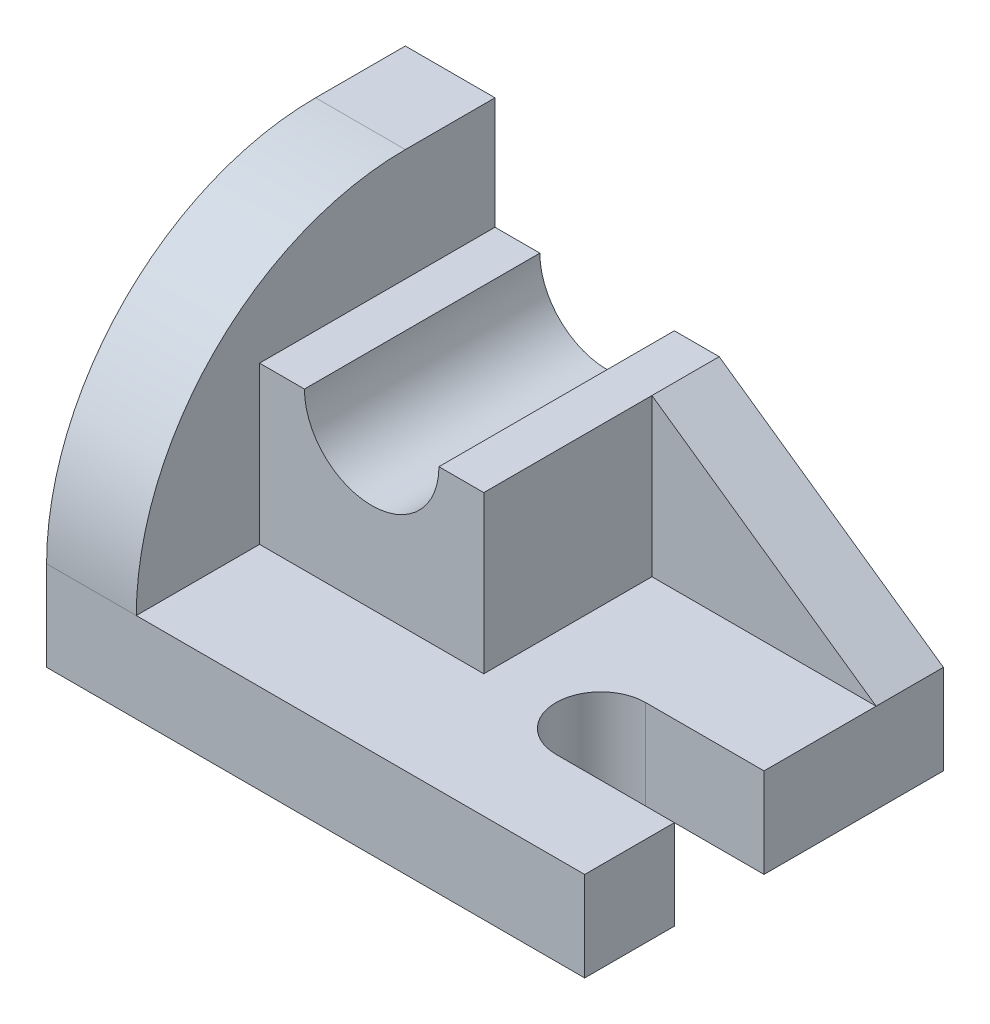
ISO-10303-21;
HEADER;
FILE_DESCRIPTION(('STEP AP214'),'2;1');
FILE_NAME('part.step','',(''),(''),'','','');
FILE_SCHEMA(('AUTOMOTIVE_DESIGN { 1 0 10303 214 1 1 1 1 }'));
ENDSEC;
DATA;
#1=APPLICATION_CONTEXT('core data for automotive mechanical design processes');
#2=APPLICATION_PROTOCOL_DEFINITION('international standard','automotive_design',2000,#1);
#3=PRODUCT_CONTEXT('',#1,'mechanical');
#4=PRODUCT('Part','Part','',(#3));
#5=PRODUCT_RELATED_PRODUCT_CATEGORY('part','',(#4));
#6=PRODUCT_DEFINITION_FORMATION('','',#4);
#7=PRODUCT_DEFINITION_CONTEXT('part definition',#1,'design');
#8=PRODUCT_DEFINITION('design','',#6,#7);
#9=PRODUCT_DEFINITION_SHAPE('','',#8);
#10=(LENGTH_UNIT() NAMED_UNIT(*) SI_UNIT(.MILLI.,.METRE.));
#11=(NAMED_UNIT(*) PLANE_ANGLE_UNIT() SI_UNIT($,.RADIAN.));
#12=(NAMED_UNIT(*) SI_UNIT($,.STERADIAN.) SOLID_ANGLE_UNIT());
#13=UNCERTAINTY_MEASURE_WITH_UNIT(LENGTH_MEASURE(1.E-05),#10,'distance_accuracy_value','');
#14=(GEOMETRIC_REPRESENTATION_CONTEXT(3) GLOBAL_UNCERTAINTY_ASSIGNED_CONTEXT((#13)) GLOBAL_UNIT_ASSIGNED_CONTEXT((#10,
#11,#12)) REPRESENTATION_CONTEXT('',''));
#15=CARTESIAN_POINT('',(0.,0.,0.));
#16=DIRECTION('',(0.,0.,1.));
#17=DIRECTION('',(1.,0.,0.));
#18=AXIS2_PLACEMENT_3D('',#15,#16,#17);
#19=CARTESIAN_POINT('',(0.,111.76,0.));
#20=DIRECTION('',(0.,-1.,0.));
#21=DIRECTION('',(0.,0.,-1.));
#22=AXIS2_PLACEMENT_3D('',#19,#20,#21);
#23=PLANE('',#22);
#24=DIRECTION('',(0.,0.,1.));
#25=VECTOR('',#24,1.);
#26=CARTESIAN_POINT('',(3.7212898054605,111.76,-121.92));
#27=LINE('',#26,#25);
#28=CARTESIAN_POINT('',(3.72128980546051,111.76,-121.92));
#29=VERTEX_POINT('',#28);
#30=CARTESIAN_POINT('',(3.7212898054605,111.76,-15.24));
#31=VERTEX_POINT('',#30);
#32=EDGE_CURVE('E162',#29,#31,#27,.T.);
#33=ORIENTED_EDGE('',*,*,#32,.F.);
#34=DIRECTION('',(-1.,0.,0.));
#35=VECTOR('',#34,1.);
#36=CARTESIAN_POINT('',(186.60128980546,111.76,-121.92));
#37=LINE('',#36,#35);
#38=CARTESIAN_POINT('',(-16.5987101945395,111.76,-121.92));
#39=VERTEX_POINT('',#38);
#40=EDGE_CURVE('E171',#29,#39,#37,.T.);
#41=ORIENTED_EDGE('',*,*,#40,.T.);
#42=DIRECTION('',(0.,0.,-1.));
#43=VECTOR('',#42,1.);
#44=CARTESIAN_POINT('',(-16.5987101945395,111.76,-15.24));
#45=LINE('',#44,#43);
#46=CARTESIAN_POINT('',(-16.5987101945395,111.76,-15.24));
#47=VERTEX_POINT('',#46);
#48=EDGE_CURVE('E180',#47,#39,#45,.T.);
#49=ORIENTED_EDGE('',*,*,#48,.F.);
#50=DIRECTION('',(1.,0.,0.));
#51=VECTOR('',#50,1.);
#52=CARTESIAN_POINT('',(-16.5987101945395,111.76,-15.24));
#53=LINE('',#52,#51);
#54=EDGE_CURVE('E186',#47,#31,#53,.T.);
#55=ORIENTED_EDGE('',*,*,#54,.T.);
#56=EDGE_LOOP('',(#33,#41,#49,#55));
#57=FACE_BOUND('',#56,.T.);
#58=ADVANCED_FACE('F43',(#57),#23,.F.);
#59=CARTESIAN_POINT('',(-16.5987101945395,111.76,-15.24));
#60=DIRECTION('',(0.,0.,-1.));
#61=DIRECTION('',(-1.,0.,0.));
#62=AXIS2_PLACEMENT_3D('',#59,#60,#61);
#63=PLANE('',#62);
#64=CARTESIAN_POINT('',(64.6812898054605,111.76,-15.24));
#65=VERTEX_POINT('',#64);
#66=CARTESIAN_POINT('',(85.0012898054605,111.76,-15.24));
#67=VERTEX_POINT('',#66);
#68=EDGE_CURVE('E182',#65,#67,#53,.T.);
#69=ORIENTED_EDGE('',*,*,#68,.F.);
#70=CARTESIAN_POINT('',(34.2012898054605,111.76,-15.24));
#71=DIRECTION('',(0.,0.,1.));
#72=DIRECTION('',(1.,0.,0.));
#73=AXIS2_PLACEMENT_3D('',#70,#71,#72);
#74=CIRCLE('',#73,30.48);
#75=EDGE_CURVE('E157',#65,#31,#74,.F.);
#76=ORIENTED_EDGE('',*,*,#75,.T.);
#77=ORIENTED_EDGE('',*,*,#54,.F.);
#78=DIRECTION('',(0.,-1.,0.));
#79=VECTOR('',#78,1.);
#80=CARTESIAN_POINT('',(-16.5987101945395,111.76,-15.24));
#81=LINE('',#80,#79);
#82=CARTESIAN_POINT('',(-16.5987101945395,40.64,-15.24));
#83=VERTEX_POINT('',#82);
#84=EDGE_CURVE('E202',#47,#83,#81,.T.);
#85=ORIENTED_EDGE('',*,*,#84,.T.);
#86=DIRECTION('',(1.,0.,0.));
#87=VECTOR('',#86,1.);
#88=CARTESIAN_POINT('',(-16.5987101945395,40.64,-15.24));
#89=LINE('',#88,#87);
#90=CARTESIAN_POINT('',(85.0012898054605,40.64,-15.24));
#91=VERTEX_POINT('',#90);
#92=EDGE_CURVE('E194',#83,#91,#89,.T.);
#93=ORIENTED_EDGE('',*,*,#92,.T.);
#94=DIRECTION('',(0.,-1.,0.));
#95=VECTOR('',#94,1.);
#96=CARTESIAN_POINT('',(85.0012898054605,111.76,-15.24));
#97=LINE('',#96,#95);
#98=EDGE_CURVE('E205',#67,#91,#97,.T.);
#99=ORIENTED_EDGE('',*,*,#98,.F.);
#100=EDGE_LOOP('',(#69,#76,#77,#85,#93,#99));
#101=FACE_BOUND('',#100,.T.);
#102=ADVANCED_FACE('F349',(#101),#63,.F.);
#103=CARTESIAN_POINT('',(132.948481923687,40.64,-20.32));
#104=DIRECTION('',(0.,-1.,0.));
#105=DIRECTION('',(0.,0.,-1.));
#106=AXIS2_PLACEMENT_3D('',#103,#104,#105);
#107=PLANE('',#106);
#108=DIRECTION('',(1.,0.,0.));
#109=VECTOR('',#108,1.);
#110=CARTESIAN_POINT('',(85.0012898054605,40.64,-91.44));
#111=LINE('',#110,#109);
#112=CARTESIAN_POINT('',(85.0012898054605,40.64,-91.44));
#113=VERTEX_POINT('',#112);
#114=CARTESIAN_POINT('',(186.60128980546,40.64,-91.44));
#115=VERTEX_POINT('',#114);
#116=EDGE_CURVE('E181',#113,#115,#111,.T.);
#117=ORIENTED_EDGE('',*,*,#116,.F.);
#118=DIRECTION('',(0.,0.,-1.));
#119=VECTOR('',#118,1.);
#120=CARTESIAN_POINT('',(85.0012898054605,40.64,-15.24));
#121=LINE('',#120,#119);
#122=EDGE_CURVE('E193',#91,#113,#121,.T.);
#123=ORIENTED_EDGE('',*,*,#122,.F.);
#124=ORIENTED_EDGE('',*,*,#92,.F.);
#125=DIRECTION('',(0.,0.,1.));
#126=VECTOR('',#125,1.);
#127=CARTESIAN_POINT('',(-16.5987101945395,40.64,0.));
#128=LINE('',#127,#126);
#129=CARTESIAN_POINT('',(-16.5987101945395,40.64,40.64));
#130=VERTEX_POINT('',#129);
#131=EDGE_CURVE('E208',#83,#130,#128,.T.);
#132=ORIENTED_EDGE('',*,*,#131,.T.);
#133=DIRECTION('',(1.,0.,0.));
#134=VECTOR('',#133,1.);
#135=CARTESIAN_POINT('',(-57.2387101945395,40.64,40.64));
#136=LINE('',#135,#134);
#137=CARTESIAN_POINT('',(186.60128980546,40.64,40.64));
#138=VERTEX_POINT('',#137);
#139=EDGE_CURVE('E226',#130,#138,#136,.T.);
#140=ORIENTED_EDGE('',*,*,#139,.T.);
#141=DIRECTION('',(0.,0.,-1.));
#142=VECTOR('',#141,1.);
#143=CARTESIAN_POINT('',(186.60128980546,40.64,40.64));
#144=LINE('',#143,#142);
#145=CARTESIAN_POINT('',(186.60128980546,40.64,0.));
#146=VERTEX_POINT('',#145);
#147=EDGE_CURVE('E228',#138,#146,#144,.T.);
#148=ORIENTED_EDGE('',*,*,#147,.T.);
#149=DIRECTION('',(-1.,0.,0.));
#150=VECTOR('',#149,1.);
#151=CARTESIAN_POINT('',(186.60128980546,40.64,0.));
#152=LINE('',#151,#150);
#153=CARTESIAN_POINT('',(132.948481923687,40.64,0.));
#154=VERTEX_POINT('',#153);
#155=EDGE_CURVE('E232',#146,#154,#152,.T.);
#156=ORIENTED_EDGE('',*,*,#155,.T.);
#157=CARTESIAN_POINT('',(132.948481923687,40.64,-20.32));
#158=DIRECTION('',(0.,-1.,0.));
#159=DIRECTION('',(0.,0.,-1.));
#160=AXIS2_PLACEMENT_3D('',#157,#158,#159);
#161=CIRCLE('',#160,20.32);
#162=CARTESIAN_POINT('',(132.948481923687,40.64,-40.64));
#163=VERTEX_POINT('',#162);
#164=EDGE_CURVE('E235',#154,#163,#161,.T.);
#165=ORIENTED_EDGE('',*,*,#164,.T.);
#166=DIRECTION('',(1.,0.,0.));
#167=VECTOR('',#166,1.);
#168=CARTESIAN_POINT('',(186.60128980546,40.64,-40.64));
#169=LINE('',#168,#167);
#170=CARTESIAN_POINT('',(186.60128980546,40.64,-40.64));
#171=VERTEX_POINT('',#170);
#172=EDGE_CURVE('E233',#163,#171,#169,.T.);
#173=ORIENTED_EDGE('',*,*,#172,.T.);
#174=DIRECTION('',(0.,0.,-1.));
#175=VECTOR('',#174,1.);
#176=CARTESIAN_POINT('',(186.60128980546,40.64,-121.92));
#177=LINE('',#176,#175);
#178=EDGE_CURVE('E224',#171,#115,#177,.T.);
#179=ORIENTED_EDGE('',*,*,#178,.T.);
#180=EDGE_LOOP('',(#117,#123,#124,#132,#140,#148,#156,#165,#173,#179));
#181=FACE_BOUND('',#180,.T.);
#182=ADVANCED_FACE('F291',(#181),#107,.F.);
#183=CARTESIAN_POINT('',(186.60128980546,40.64,-121.92));
#184=DIRECTION('',(-1.,0.,0.));
#185=DIRECTION('',(0.,0.,1.));
#186=AXIS2_PLACEMENT_3D('',#183,#184,#185);
#187=PLANE('',#186);
#188=DIRECTION('',(0.,-1.,0.));
#189=VECTOR('',#188,1.);
#190=CARTESIAN_POINT('',(186.60128980546,40.64,-121.92));
#191=LINE('',#190,#189);
#192=CARTESIAN_POINT('',(186.60128980546,40.6399999999998,-121.92));
#193=VERTEX_POINT('',#192);
#194=CARTESIAN_POINT('',(186.60128980546,0.,-121.92));
#195=VERTEX_POINT('',#194);
#196=EDGE_CURVE('E272',#193,#195,#191,.T.);
#197=ORIENTED_EDGE('',*,*,#196,.F.);
#198=DIRECTION('',(0.,0.,1.));
#199=VECTOR('',#198,1.);
#200=CARTESIAN_POINT('',(186.60128980546,40.6399999999998,-121.92));
#201=LINE('',#200,#199);
#202=EDGE_CURVE('E279',#193,#115,#201,.T.);
#203=ORIENTED_EDGE('',*,*,#202,.T.);
#204=ORIENTED_EDGE('',*,*,#178,.F.);
#205=DIRECTION('',(0.,-1.,0.));
#206=VECTOR('',#205,1.);
#207=CARTESIAN_POINT('',(186.60128980546,40.64,-40.64));
#208=LINE('',#207,#206);
#209=CARTESIAN_POINT('',(186.60128980546,0.,-40.64));
#210=VERTEX_POINT('',#209);
#211=EDGE_CURVE('E240',#171,#210,#208,.T.);
#212=ORIENTED_EDGE('',*,*,#211,.T.);
#213=DIRECTION('',(0.,0.,-1.));
#214=VECTOR('',#213,1.);
#215=CARTESIAN_POINT('',(186.60128980546,0.,-121.92));
#216=LINE('',#215,#214);
#217=EDGE_CURVE('E225',#210,#195,#216,.T.);
#218=ORIENTED_EDGE('',*,*,#217,.T.);
#219=EDGE_LOOP('',(#197,#203,#204,#212,#218));
#220=FACE_BOUND('',#219,.T.);
#221=ADVANCED_FACE('F338',(#220),#187,.F.);
#222=CARTESIAN_POINT('',(186.60128980546,40.64,-121.92));
#223=DIRECTION('',(0.,0.,1.));
#224=DIRECTION('',(1.,0.,0.));
#225=AXIS2_PLACEMENT_3D('',#222,#223,#224);
#226=PLANE('',#225);
#227=CARTESIAN_POINT('',(34.2012898054605,111.76,-121.92));
#228=DIRECTION('',(0.,0.,1.));
#229=DIRECTION('',(1.,0.,0.));
#230=AXIS2_PLACEMENT_3D('',#227,#228,#229);
#231=CIRCLE('',#230,30.48);
#232=CARTESIAN_POINT('',(64.6812898054605,111.76,-121.92));
#233=VERTEX_POINT('',#232);
#234=EDGE_CURVE('E59',#233,#29,#231,.F.);
#235=ORIENTED_EDGE('',*,*,#234,.F.);
#236=CARTESIAN_POINT('',(85.00128980546,111.76,-121.92));
#237=VERTEX_POINT('',#236);
#238=EDGE_CURVE('E166',#237,#233,#37,.T.);
#239=ORIENTED_EDGE('',*,*,#238,.F.);
#240=DIRECTION('',(-0.819231920519041,0.573462344363327,0.));
#241=VECTOR('',#240,1.);
#242=CARTESIAN_POINT('',(85.00128980546,111.76,-121.92));
#243=LINE('',#242,#241);
#244=EDGE_CURVE('E277',#237,#193,#243,.F.);
#245=ORIENTED_EDGE('',*,*,#244,.T.);
#246=ORIENTED_EDGE('',*,*,#196,.T.);
#247=DIRECTION('',(-1.,0.,0.));
#248=VECTOR('',#247,1.);
#249=CARTESIAN_POINT('',(186.60128980546,0.,-121.92));
#250=LINE('',#249,#248);
#251=CARTESIAN_POINT('',(-57.2387101945395,0.,-121.92));
#252=VERTEX_POINT('',#251);
#253=EDGE_CURVE('E238',#195,#252,#250,.T.);
#254=ORIENTED_EDGE('',*,*,#253,.T.);
#255=DIRECTION('',(0.,-1.,0.));
#256=VECTOR('',#255,1.);
#257=CARTESIAN_POINT('',(-57.2387101945395,40.64,-121.92));
#258=LINE('',#257,#256);
#259=CARTESIAN_POINT('',(-57.2387101945395,162.56,-121.92));
#260=VERTEX_POINT('',#259);
#261=EDGE_CURVE('E269',#260,#252,#258,.T.);
#262=ORIENTED_EDGE('',*,*,#261,.F.);
#263=DIRECTION('',(-1.,0.,0.));
#264=VECTOR('',#263,1.);
#265=CARTESIAN_POINT('',(0.,162.56,-121.92));
#266=LINE('',#265,#264);
#267=CARTESIAN_POINT('',(-16.5987101945395,162.56,-121.92));
#268=VERTEX_POINT('',#267);
#269=EDGE_CURVE('E215',#268,#260,#266,.T.);
#270=ORIENTED_EDGE('',*,*,#269,.F.);
#271=DIRECTION('',(0.,-1.,0.));
#272=VECTOR('',#271,1.);
#273=CARTESIAN_POINT('',(-16.5987101945395,162.56,-121.92));
#274=LINE('',#273,#272);
#275=EDGE_CURVE('E217',#268,#39,#274,.T.);
#276=ORIENTED_EDGE('',*,*,#275,.T.);
#277=ORIENTED_EDGE('',*,*,#40,.F.);
#278=EDGE_LOOP('',(#235,#239,#245,#246,#254,#262,#270,#276,#277));
#279=FACE_BOUND('',#278,.T.);
#280=ADVANCED_FACE('F169',(#279),#226,.F.);
#281=CARTESIAN_POINT('',(-57.2387101945395,40.64,-121.92));
#282=DIRECTION('',(1.,0.,0.));
#283=DIRECTION('',(0.,0.,-1.));
#284=AXIS2_PLACEMENT_3D('',#281,#282,#283);
#285=PLANE('',#284);
#286=DIRECTION('',(0.,-1.,0.));
#287=VECTOR('',#286,1.);
#288=CARTESIAN_POINT('',(-57.2387101945395,40.64,40.64));
#289=LINE('',#288,#287);
#290=CARTESIAN_POINT('',(-57.2387101945395,40.64,40.64));
#291=VERTEX_POINT('',#290);
#292=CARTESIAN_POINT('',(-57.2387101945395,0.,40.64));
#293=VERTEX_POINT('',#292);
#294=EDGE_CURVE('E268',#291,#293,#289,.T.);
#295=ORIENTED_EDGE('',*,*,#294,.F.);
#296=CARTESIAN_POINT('',(-57.2387101945395,40.64,-81.28));
#297=DIRECTION('',(1.,0.,0.));
#298=DIRECTION('',(0.,0.,-1.));
#299=AXIS2_PLACEMENT_3D('',#296,#297,#298);
#300=CIRCLE('',#299,121.92);
#301=CARTESIAN_POINT('',(-57.2387101945395,162.56,-81.28));
#302=VERTEX_POINT('',#301);
#303=EDGE_CURVE('E11',#291,#302,#300,.F.);
#304=ORIENTED_EDGE('',*,*,#303,.T.);
#305=DIRECTION('',(0.,0.,1.));
#306=VECTOR('',#305,1.);
#307=CARTESIAN_POINT('',(-57.2387101945395,162.56,0.));
#308=LINE('',#307,#306);
#309=EDGE_CURVE('E214',#260,#302,#308,.T.);
#310=ORIENTED_EDGE('',*,*,#309,.F.);
#311=ORIENTED_EDGE('',*,*,#261,.T.);
#312=DIRECTION('',(0.,0.,1.));
#313=VECTOR('',#312,1.);
#314=CARTESIAN_POINT('',(-57.2387101945395,0.,-121.92));
#315=LINE('',#314,#313);
#316=EDGE_CURVE('E242',#252,#293,#315,.T.);
#317=ORIENTED_EDGE('',*,*,#316,.T.);
#318=EDGE_LOOP('',(#295,#304,#310,#311,#317));
#319=FACE_BOUND('',#318,.T.);
#320=ADVANCED_FACE('F300',(#319),#285,.F.);
#321=CARTESIAN_POINT('',(-57.2387101945395,40.64,40.64));
#322=DIRECTION('',(0.,0.,-1.));
#323=DIRECTION('',(-1.,0.,0.));
#324=AXIS2_PLACEMENT_3D('',#321,#322,#323);
#325=PLANE('',#324);
#326=ORIENTED_EDGE('',*,*,#139,.F.);
#327=DIRECTION('',(1.,0.,0.));
#328=VECTOR('',#327,1.);
#329=CARTESIAN_POINT('',(-57.2387101945395,40.64,40.64));
#330=LINE('',#329,#328);
#331=EDGE_CURVE('E51',#130,#291,#330,.F.);
#332=ORIENTED_EDGE('',*,*,#331,.T.);
#333=ORIENTED_EDGE('',*,*,#294,.T.);
#334=DIRECTION('',(1.,0.,0.));
#335=VECTOR('',#334,1.);
#336=CARTESIAN_POINT('',(-57.2387101945395,0.,40.64));
#337=LINE('',#336,#335);
#338=CARTESIAN_POINT('',(186.60128980546,0.,40.64));
#339=VERTEX_POINT('',#338);
#340=EDGE_CURVE('E245',#293,#339,#337,.T.);
#341=ORIENTED_EDGE('',*,*,#340,.T.);
#342=DIRECTION('',(0.,-1.,0.));
#343=VECTOR('',#342,1.);
#344=CARTESIAN_POINT('',(186.60128980546,40.64,40.64));
#345=LINE('',#344,#343);
#346=EDGE_CURVE('E264',#138,#339,#345,.T.);
#347=ORIENTED_EDGE('',*,*,#346,.F.);
#348=EDGE_LOOP('',(#326,#332,#333,#341,#347));
#349=FACE_BOUND('',#348,.T.);
#350=ADVANCED_FACE('F293',(#349),#325,.F.);
#351=CARTESIAN_POINT('',(186.60128980546,40.64,40.64));
#352=DIRECTION('',(-1.,0.,0.));
#353=DIRECTION('',(0.,0.,1.));
#354=AXIS2_PLACEMENT_3D('',#351,#352,#353);
#355=PLANE('',#354);
#356=DIRECTION('',(0.,0.,-1.));
#357=VECTOR('',#356,1.);
#358=CARTESIAN_POINT('',(186.60128980546,0.,40.64));
#359=LINE('',#358,#357);
#360=CARTESIAN_POINT('',(186.60128980546,0.,0.));
#361=VERTEX_POINT('',#360);
#362=EDGE_CURVE('E249',#339,#361,#359,.T.);
#363=ORIENTED_EDGE('',*,*,#362,.T.);
#364=DIRECTION('',(0.,-1.,0.));
#365=VECTOR('',#364,1.);
#366=CARTESIAN_POINT('',(186.60128980546,40.64,0.));
#367=LINE('',#366,#365);
#368=EDGE_CURVE('E265',#146,#361,#367,.T.);
#369=ORIENTED_EDGE('',*,*,#368,.F.);
#370=ORIENTED_EDGE('',*,*,#147,.F.);
#371=ORIENTED_EDGE('',*,*,#346,.T.);
#372=EDGE_LOOP('',(#363,#369,#370,#371));
#373=FACE_BOUND('',#372,.T.);
#374=ADVANCED_FACE('F311',(#373),#355,.F.);
#375=CARTESIAN_POINT('',(186.60128980546,40.64,0.));
#376=DIRECTION('',(0.,0.,1.));
#377=DIRECTION('',(1.,0.,0.));
#378=AXIS2_PLACEMENT_3D('',#375,#376,#377);
#379=PLANE('',#378);
#380=DIRECTION('',(-1.,0.,0.));
#381=VECTOR('',#380,1.);
#382=CARTESIAN_POINT('',(186.60128980546,0.,0.));
#383=LINE('',#382,#381);
#384=CARTESIAN_POINT('',(132.948481923687,0.,0.));
#385=VERTEX_POINT('',#384);
#386=EDGE_CURVE('E246',#361,#385,#383,.T.);
#387=ORIENTED_EDGE('',*,*,#386,.T.);
#388=DIRECTION('',(0.,-1.,0.));
#389=VECTOR('',#388,1.);
#390=CARTESIAN_POINT('',(132.948481923687,40.64,0.));
#391=LINE('',#390,#389);
#392=EDGE_CURVE('E259',#154,#385,#391,.T.);
#393=ORIENTED_EDGE('',*,*,#392,.F.);
#394=ORIENTED_EDGE('',*,*,#155,.F.);
#395=ORIENTED_EDGE('',*,*,#368,.T.);
#396=EDGE_LOOP('',(#387,#393,#394,#395));
#397=FACE_BOUND('',#396,.T.);
#398=ADVANCED_FACE('F319',(#397),#379,.F.);
#399=CARTESIAN_POINT('',(132.948481923687,40.64,-20.32));
#400=DIRECTION('',(0.,-1.,0.));
#401=DIRECTION('',(0.,0.,-1.));
#402=AXIS2_PLACEMENT_3D('',#399,#400,#401);
#403=CYLINDRICAL_SURFACE('',#402,20.32);
#404=CARTESIAN_POINT('',(132.948481923687,0.,-20.32));
#405=DIRECTION('',(0.,-1.,0.));
#406=DIRECTION('',(0.,0.,-1.));
#407=AXIS2_PLACEMENT_3D('',#404,#405,#406);
#408=CIRCLE('',#407,20.32);
#409=CARTESIAN_POINT('',(132.948481923687,0.,-40.64));
#410=VERTEX_POINT('',#409);
#411=EDGE_CURVE('E253',#385,#410,#408,.T.);
#412=ORIENTED_EDGE('',*,*,#411,.T.);
#413=DIRECTION('',(0.,-1.,0.));
#414=VECTOR('',#413,1.);
#415=CARTESIAN_POINT('',(132.948481923687,40.64,-40.64));
#416=LINE('',#415,#414);
#417=EDGE_CURVE('E258',#163,#410,#416,.T.);
#418=ORIENTED_EDGE('',*,*,#417,.F.);
#419=ORIENTED_EDGE('',*,*,#164,.F.);
#420=ORIENTED_EDGE('',*,*,#392,.T.);
#421=EDGE_LOOP('',(#412,#418,#419,#420));
#422=FACE_BOUND('',#421,.T.);
#423=ADVANCED_FACE('F323',(#422),#403,.F.);
#424=CARTESIAN_POINT('',(186.60128980546,40.64,-40.64));
#425=DIRECTION('',(0.,0.,-1.));
#426=DIRECTION('',(-1.,0.,0.));
#427=AXIS2_PLACEMENT_3D('',#424,#425,#426);
#428=PLANE('',#427);
#429=DIRECTION('',(1.,0.,0.));
#430=VECTOR('',#429,1.);
#431=CARTESIAN_POINT('',(186.60128980546,0.,-40.64));
#432=LINE('',#431,#430);
#433=EDGE_CURVE('E227',#410,#210,#432,.T.);
#434=ORIENTED_EDGE('',*,*,#433,.T.);
#435=ORIENTED_EDGE('',*,*,#211,.F.);
#436=ORIENTED_EDGE('',*,*,#172,.F.);
#437=ORIENTED_EDGE('',*,*,#417,.T.);
#438=EDGE_LOOP('',(#434,#435,#436,#437));
#439=FACE_BOUND('',#438,.T.);
#440=ADVANCED_FACE('F327',(#439),#428,.F.);
#441=CARTESIAN_POINT('',(132.948481923687,0.,-20.32));
#442=DIRECTION('',(0.,-1.,0.));
#443=DIRECTION('',(0.,0.,-1.));
#444=AXIS2_PLACEMENT_3D('',#441,#442,#443);
#445=PLANE('',#444);
#446=ORIENTED_EDGE('',*,*,#217,.F.);
#447=ORIENTED_EDGE('',*,*,#433,.F.);
#448=ORIENTED_EDGE('',*,*,#411,.F.);
#449=ORIENTED_EDGE('',*,*,#386,.F.);
#450=ORIENTED_EDGE('',*,*,#362,.F.);
#451=ORIENTED_EDGE('',*,*,#340,.F.);
#452=ORIENTED_EDGE('',*,*,#316,.F.);
#453=ORIENTED_EDGE('',*,*,#253,.F.);
#454=EDGE_LOOP('',(#446,#447,#448,#449,#450,#451,#452,#453));
#455=FACE_BOUND('',#454,.T.);
#456=ADVANCED_FACE('F310',(#455),#445,.T.);
#457=CARTESIAN_POINT('',(-16.5987101945395,162.56,0.));
#458=DIRECTION('',(1.,0.,0.));
#459=DIRECTION('',(0.,0.,-1.));
#460=AXIS2_PLACEMENT_3D('',#457,#458,#459);
#461=PLANE('',#460);
#462=DIRECTION('',(0.,0.,1.));
#463=VECTOR('',#462,1.);
#464=CARTESIAN_POINT('',(-16.5987101945395,162.56,0.));
#465=LINE('',#464,#463);
#466=CARTESIAN_POINT('',(-16.5987101945395,162.56,-81.28));
#467=VERTEX_POINT('',#466);
#468=EDGE_CURVE('E207',#268,#467,#465,.T.);
#469=ORIENTED_EDGE('',*,*,#468,.T.);
#470=CARTESIAN_POINT('',(-16.5987101945395,40.64,-81.28));
#471=DIRECTION('',(1.,0.,0.));
#472=DIRECTION('',(0.,0.,-1.));
#473=AXIS2_PLACEMENT_3D('',#470,#471,#472);
#474=CIRCLE('',#473,121.92);
#475=EDGE_CURVE('E285',#467,#130,#474,.T.);
#476=ORIENTED_EDGE('',*,*,#475,.T.);
#477=ORIENTED_EDGE('',*,*,#131,.F.);
#478=ORIENTED_EDGE('',*,*,#84,.F.);
#479=ORIENTED_EDGE('',*,*,#48,.T.);
#480=ORIENTED_EDGE('',*,*,#275,.F.);
#481=EDGE_LOOP('',(#469,#476,#477,#478,#479,#480));
#482=FACE_BOUND('',#481,.T.);
#483=ADVANCED_FACE('F290',(#482),#461,.T.);
#484=CARTESIAN_POINT('',(0.,162.56,0.));
#485=DIRECTION('',(0.,1.,0.));
#486=DIRECTION('',(0.,0.,1.));
#487=AXIS2_PLACEMENT_3D('',#484,#485,#486);
#488=PLANE('',#487);
#489=ORIENTED_EDGE('',*,*,#309,.T.);
#490=DIRECTION('',(1.,0.,0.));
#491=VECTOR('',#490,1.);
#492=CARTESIAN_POINT('',(-16.5987101945395,162.56,-81.28));
#493=LINE('',#492,#491);
#494=EDGE_CURVE('E282',#302,#467,#493,.T.);
#495=ORIENTED_EDGE('',*,*,#494,.T.);
#496=ORIENTED_EDGE('',*,*,#468,.F.);
#497=ORIENTED_EDGE('',*,*,#269,.T.);
#498=EDGE_LOOP('',(#489,#495,#496,#497));
#499=FACE_BOUND('',#498,.T.);
#500=ADVANCED_FACE('F304',(#499),#488,.T.);
#501=CARTESIAN_POINT('',(85.0012898054605,111.76,-15.24));
#502=DIRECTION('',(-1.,0.,0.));
#503=DIRECTION('',(0.,0.,1.));
#504=AXIS2_PLACEMENT_3D('',#501,#502,#503);
#505=PLANE('',#504);
#506=ORIENTED_EDGE('',*,*,#122,.T.);
#507=DIRECTION('',(0.,-1.,0.));
#508=VECTOR('',#507,1.);
#509=CARTESIAN_POINT('',(85.0012898054605,111.76,-91.44));
#510=LINE('',#509,#508);
#511=CARTESIAN_POINT('',(85.0012898054605,111.76,-91.44));
#512=VERTEX_POINT('',#511);
#513=EDGE_CURVE('E192',#512,#113,#510,.T.);
#514=ORIENTED_EDGE('',*,*,#513,.F.);
#515=DIRECTION('',(0.,0.,-1.));
#516=VECTOR('',#515,1.);
#517=CARTESIAN_POINT('',(85.0012898054605,111.76,-15.24));
#518=LINE('',#517,#516);
#519=EDGE_CURVE('E188',#67,#512,#518,.T.);
#520=ORIENTED_EDGE('',*,*,#519,.F.);
#521=ORIENTED_EDGE('',*,*,#98,.T.);
#522=EDGE_LOOP('',(#506,#514,#520,#521));
#523=FACE_BOUND('',#522,.T.);
#524=ADVANCED_FACE('F366',(#523),#505,.F.);
#525=CARTESIAN_POINT('',(85.0012898054605,111.76,-91.44));
#526=DIRECTION('',(0.,0.,-1.));
#527=DIRECTION('',(-1.,0.,0.));
#528=AXIS2_PLACEMENT_3D('',#525,#526,#527);
#529=PLANE('',#528);
#530=ORIENTED_EDGE('',*,*,#116,.T.);
#531=DIRECTION('',(0.819231920519041,-0.573462344363327,0.));
#532=VECTOR('',#531,1.);
#533=CARTESIAN_POINT('',(85.00128980546,111.76,-91.44));
#534=LINE('',#533,#532);
#535=EDGE_CURVE('E278',#115,#512,#534,.F.);
#536=ORIENTED_EDGE('',*,*,#535,.T.);
#537=ORIENTED_EDGE('',*,*,#513,.T.);
#538=EDGE_LOOP('',(#530,#536,#537));
#539=FACE_BOUND('',#538,.T.);
#540=ADVANCED_FACE('F334',(#539),#529,.F.);
#541=ORIENTED_EDGE('',*,*,#238,.T.);
#542=DIRECTION('',(0.,0.,1.));
#543=VECTOR('',#542,1.);
#544=CARTESIAN_POINT('',(64.6812898054605,111.76,-121.92));
#545=LINE('',#544,#543);
#546=EDGE_CURVE('E156',#233,#65,#545,.T.);
#547=ORIENTED_EDGE('',*,*,#546,.T.);
#548=ORIENTED_EDGE('',*,*,#68,.T.);
#549=ORIENTED_EDGE('',*,*,#519,.T.);
#550=DIRECTION('',(0.,0.,-1.));
#551=VECTOR('',#550,1.);
#552=CARTESIAN_POINT('',(85.00128980546,111.76,0.));
#553=LINE('',#552,#551);
#554=EDGE_CURVE('E179',#512,#237,#553,.T.);
#555=ORIENTED_EDGE('',*,*,#554,.T.);
#556=EDGE_LOOP('',(#541,#547,#548,#549,#555));
#557=FACE_BOUND('',#556,.T.);
#558=ADVANCED_FACE('F173',(#557),#23,.F.);
#559=CARTESIAN_POINT('',(85.00128980546,111.76,0.));
#560=DIRECTION('',(-0.573462344363327,-0.819231920519041,0.));
#561=DIRECTION('',(0.,0.,-1.));
#562=AXIS2_PLACEMENT_3D('',#559,#560,#561);
#563=PLANE('',#562);
#564=ORIENTED_EDGE('',*,*,#535,.F.);
#565=ORIENTED_EDGE('',*,*,#202,.F.);
#566=ORIENTED_EDGE('',*,*,#244,.F.);
#567=ORIENTED_EDGE('',*,*,#554,.F.);
#568=EDGE_LOOP('',(#564,#565,#566,#567));
#569=FACE_BOUND('',#568,.T.);
#570=ADVANCED_FACE('F337',(#569),#563,.F.);
#571=CARTESIAN_POINT('',(0.,40.64,-81.28));
#572=DIRECTION('',(-1.,0.,0.));
#573=DIRECTION('',(0.,0.,1.));
#574=AXIS2_PLACEMENT_3D('',#571,#572,#573);
#575=CYLINDRICAL_SURFACE('',#574,121.92);
#576=ORIENTED_EDGE('',*,*,#303,.F.);
#577=ORIENTED_EDGE('',*,*,#331,.F.);
#578=ORIENTED_EDGE('',*,*,#475,.F.);
#579=ORIENTED_EDGE('',*,*,#494,.F.);
#580=EDGE_LOOP('',(#576,#577,#578,#579));
#581=FACE_BOUND('',#580,.T.);
#582=ADVANCED_FACE('F44',(#581),#575,.T.);
#583=CARTESIAN_POINT('',(34.2012898054605,111.76,-121.92));
#584=DIRECTION('',(0.,0.,1.));
#585=DIRECTION('',(1.,0.,0.));
#586=AXIS2_PLACEMENT_3D('',#583,#584,#585);
#587=CYLINDRICAL_SURFACE('',#586,30.48);
#588=ORIENTED_EDGE('',*,*,#75,.F.);
#589=ORIENTED_EDGE('',*,*,#546,.F.);
#590=ORIENTED_EDGE('',*,*,#234,.T.);
#591=ORIENTED_EDGE('',*,*,#32,.T.);
#592=EDGE_LOOP('',(#588,#589,#590,#591));
#593=FACE_BOUND('',#592,.T.);
#594=ADVANCED_FACE('F160',(#593),#587,.F.);
#595=CLOSED_SHELL('',(#58,#102,#182,#221,#280,#320,#350,#374,#398,#423,#440,#456,#483,#500,#524,
#540,#558,#570,#582,#594));
#596=MANIFOLD_SOLID_BREP('B2',#595);
#597=ADVANCED_BREP_SHAPE_REPRESENTATION('',(#18,#596),#14);
#598=SHAPE_DEFINITION_REPRESENTATION(#9,#597);
ENDSEC;
END-ISO-10303-21;
